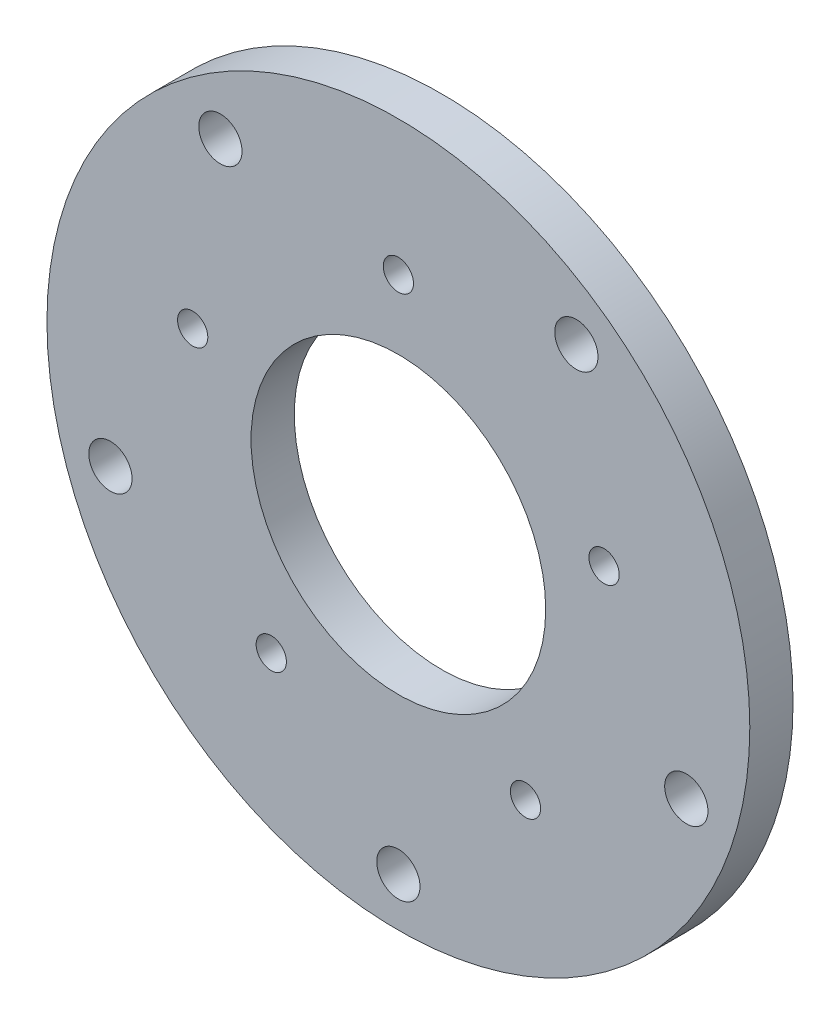
ISO-10303-21;
HEADER;
FILE_DESCRIPTION(('STEP AP214'),'2;1');
FILE_NAME('part.step','',(''),(''),'','','');
FILE_SCHEMA(('AUTOMOTIVE_DESIGN { 1 0 10303 214 1 1 1 1 }'));
ENDSEC;
DATA;
#1=APPLICATION_CONTEXT('core data for automotive mechanical design processes');
#2=APPLICATION_PROTOCOL_DEFINITION('international standard','automotive_design',2000,#1);
#3=PRODUCT_CONTEXT('',#1,'mechanical');
#4=PRODUCT('Part','Part','',(#3));
#5=PRODUCT_RELATED_PRODUCT_CATEGORY('part','',(#4));
#6=PRODUCT_DEFINITION_FORMATION('','',#4);
#7=PRODUCT_DEFINITION_CONTEXT('part definition',#1,'design');
#8=PRODUCT_DEFINITION('design','',#6,#7);
#9=PRODUCT_DEFINITION_SHAPE('','',#8);
#10=(LENGTH_UNIT() NAMED_UNIT(*) SI_UNIT(.MILLI.,.METRE.));
#11=(NAMED_UNIT(*) PLANE_ANGLE_UNIT() SI_UNIT($,.RADIAN.));
#12=(NAMED_UNIT(*) SI_UNIT($,.STERADIAN.) SOLID_ANGLE_UNIT());
#13=UNCERTAINTY_MEASURE_WITH_UNIT(LENGTH_MEASURE(1.E-05),#10,'distance_accuracy_value','');
#14=(GEOMETRIC_REPRESENTATION_CONTEXT(3) GLOBAL_UNCERTAINTY_ASSIGNED_CONTEXT((#13)) GLOBAL_UNIT_ASSIGNED_CONTEXT((#10,
#11,#12)) REPRESENTATION_CONTEXT('',''));
#15=CARTESIAN_POINT('',(0.,0.,0.));
#16=DIRECTION('',(0.,0.,1.));
#17=DIRECTION('',(1.,0.,0.));
#18=AXIS2_PLACEMENT_3D('',#15,#16,#17);
#19=CARTESIAN_POINT('',(-0.261189044756166,0.652972611890443,4.));
#20=DIRECTION('',(0.,0.,1.));
#21=DIRECTION('',(1.,0.,0.));
#22=AXIS2_PLACEMENT_3D('',#19,#20,#21);
#23=PLANE('',#22);
#24=CARTESIAN_POINT('',(18.759941281147,6.83331249938919,4.));
#25=DIRECTION('',(0.,0.,1.));
#26=DIRECTION('',(1.,0.,0.));
#27=AXIS2_PLACEMENT_3D('',#24,#25,#26);
#28=CIRCLE('',#27,1.4);
#29=CARTESIAN_POINT('',(20.159941281147,6.83331249938919,4.));
#30=VERTEX_POINT('',#29);
#31=EDGE_CURVE('E120',#30,#30,#28,.T.);
#32=ORIENTED_EDGE('',*,*,#31,.F.);
#33=EDGE_LOOP('',(#32));
#34=FACE_BOUND('',#33,.T.);
#35=CARTESIAN_POINT('',(-19.2823193706592,6.83331249938948,4.));
#36=DIRECTION('',(0.,0.,1.));
#37=DIRECTION('',(1.,0.,0.));
#38=AXIS2_PLACEMENT_3D('',#35,#36,#37);
#39=CIRCLE('',#38,1.4);
#40=CARTESIAN_POINT('',(-17.8823193706592,6.83331249938948,4.));
#41=VERTEX_POINT('',#40);
#42=EDGE_CURVE('E104',#41,#41,#39,.T.);
#43=ORIENTED_EDGE('',*,*,#42,.F.);
#44=EDGE_LOOP('',(#43));
#45=FACE_BOUND('',#44,.T.);
#46=CARTESIAN_POINT('',(26.368393411508,-7.99950323060838,4.));
#47=DIRECTION('',(0.,0.,1.));
#48=DIRECTION('',(1.,0.,0.));
#49=AXIS2_PLACEMENT_3D('',#46,#47,#48);
#50=CIRCLE('',#49,2.);
#51=CARTESIAN_POINT('',(28.368393411508,-7.99950323060838,4.));
#52=VERTEX_POINT('',#51);
#53=EDGE_CURVE('E88',#52,#52,#50,.T.);
#54=ORIENTED_EDGE('',*,*,#53,.F.);
#55=EDGE_LOOP('',(#54));
#56=FACE_BOUND('',#55,.T.);
#57=CARTESIAN_POINT('',(-16.7191761089453,23.3054484543891,4.));
#58=DIRECTION('',(0.,0.,1.));
#59=DIRECTION('',(1.,0.,0.));
#60=AXIS2_PLACEMENT_3D('',#57,#58,#59);
#61=CIRCLE('',#60,2.);
#62=CARTESIAN_POINT('',(-14.7191761089453,23.3054484543891,4.));
#63=VERTEX_POINT('',#62);
#64=EDGE_CURVE('E72',#63,#63,#61,.T.);
#65=ORIENTED_EDGE('',*,*,#64,.F.);
#66=EDGE_LOOP('',(#65));
#67=FACE_BOUND('',#66,.T.);
#68=CARTESIAN_POINT('',(-0.261189044756163,-27.3470273881096,4.));
#69=DIRECTION('',(0.,0.,1.));
#70=DIRECTION('',(1.,0.,0.));
#71=AXIS2_PLACEMENT_3D('',#68,#69,#70);
#72=CIRCLE('',#71,2.);
#73=CARTESIAN_POINT('',(1.73881095524384,-27.3470273881096,4.));
#74=VERTEX_POINT('',#73);
#75=EDGE_CURVE('E56',#74,#74,#72,.T.);
#76=ORIENTED_EDGE('',*,*,#75,.F.);
#77=EDGE_LOOP('',(#76));
#78=FACE_BOUND('',#77,.T.);
#79=CARTESIAN_POINT('',(-0.261189044756166,0.652972611890443,4.));
#80=DIRECTION('',(0.,0.,1.));
#81=DIRECTION('',(1.,0.,0.));
#82=AXIS2_PLACEMENT_3D('',#79,#80,#81);
#83=CIRCLE('',#82,32.5);
#84=CARTESIAN_POINT('',(32.2388109552438,0.652972611890443,4.));
#85=VERTEX_POINT('',#84);
#86=EDGE_CURVE('E10',#85,#85,#83,.T.);
#87=ORIENTED_EDGE('',*,*,#86,.T.);
#88=EDGE_LOOP('',(#87));
#89=FACE_BOUND('',#88,.T.);
#90=CARTESIAN_POINT('',(-0.261189044756166,0.652972611890443,4.));
#91=DIRECTION('',(0.,0.,1.));
#92=DIRECTION('',(1.,0.,0.));
#93=AXIS2_PLACEMENT_3D('',#90,#91,#92);
#94=CIRCLE('',#93,13.625);
#95=CARTESIAN_POINT('',(13.3638109552438,0.652972611890443,4.));
#96=VERTEX_POINT('',#95);
#97=EDGE_CURVE('E50',#96,#96,#94,.T.);
#98=ORIENTED_EDGE('',*,*,#97,.F.);
#99=EDGE_LOOP('',(#98));
#100=FACE_BOUND('',#99,.T.);
#101=CARTESIAN_POINT('',(-26.8907715010205,-7.99950323060802,4.));
#102=DIRECTION('',(0.,0.,1.));
#103=DIRECTION('',(1.,0.,0.));
#104=AXIS2_PLACEMENT_3D('',#101,#102,#103);
#105=CIRCLE('',#104,2.);
#106=CARTESIAN_POINT('',(-24.8907715010205,-7.99950323060802,4.));
#107=VERTEX_POINT('',#106);
#108=EDGE_CURVE('E64',#107,#107,#105,.T.);
#109=ORIENTED_EDGE('',*,*,#108,.F.);
#110=EDGE_LOOP('',(#109));
#111=FACE_BOUND('',#110,.T.);
#112=CARTESIAN_POINT('',(16.1967980194333,23.3054484543888,4.));
#113=DIRECTION('',(0.,0.,1.));
#114=DIRECTION('',(1.,0.,0.));
#115=AXIS2_PLACEMENT_3D('',#112,#113,#114);
#116=CIRCLE('',#115,2.);
#117=CARTESIAN_POINT('',(18.1967980194333,23.3054484543888,4.));
#118=VERTEX_POINT('',#117);
#119=EDGE_CURVE('E80',#118,#118,#116,.T.);
#120=ORIENTED_EDGE('',*,*,#119,.F.);
#121=EDGE_LOOP('',(#120));
#122=FACE_BOUND('',#121,.T.);
#123=CARTESIAN_POINT('',(-12.0168940906057,-15.5273672756085,4.));
#124=DIRECTION('',(0.,0.,1.));
#125=DIRECTION('',(1.,0.,0.));
#126=AXIS2_PLACEMENT_3D('',#123,#124,#125);
#127=CIRCLE('',#126,1.4);
#128=CARTESIAN_POINT('',(-10.6168940906057,-15.5273672756085,4.));
#129=VERTEX_POINT('',#128);
#130=EDGE_CURVE('E96',#129,#129,#127,.T.);
#131=ORIENTED_EDGE('',*,*,#130,.F.);
#132=EDGE_LOOP('',(#131));
#133=FACE_BOUND('',#132,.T.);
#134=CARTESIAN_POINT('',(-0.261189044756015,20.6529726118904,4.));
#135=DIRECTION('',(0.,0.,1.));
#136=DIRECTION('',(1.,0.,0.));
#137=AXIS2_PLACEMENT_3D('',#134,#135,#136);
#138=CIRCLE('',#137,1.4);
#139=CARTESIAN_POINT('',(1.13881095524398,20.6529726118904,4.));
#140=VERTEX_POINT('',#139);
#141=EDGE_CURVE('E112',#140,#140,#138,.T.);
#142=ORIENTED_EDGE('',*,*,#141,.F.);
#143=EDGE_LOOP('',(#142));
#144=FACE_BOUND('',#143,.T.);
#145=CARTESIAN_POINT('',(11.4945160010931,-15.5273672756087,4.));
#146=DIRECTION('',(0.,0.,1.));
#147=DIRECTION('',(1.,0.,0.));
#148=AXIS2_PLACEMENT_3D('',#145,#146,#147);
#149=CIRCLE('',#148,1.4);
#150=CARTESIAN_POINT('',(12.8945160010931,-15.5273672756087,4.));
#151=VERTEX_POINT('',#150);
#152=EDGE_CURVE('E128',#151,#151,#149,.T.);
#153=ORIENTED_EDGE('',*,*,#152,.F.);
#154=EDGE_LOOP('',(#153));
#155=FACE_BOUND('',#154,.T.);
#156=ADVANCED_FACE('F37',(#34,#45,#56,#67,#78,#89,#100,#111,#122,#133,#144,#155),#23,.T.);
#157=CARTESIAN_POINT('',(-0.261189044756166,0.652972611890443,0.));
#158=DIRECTION('',(0.,0.,1.));
#159=DIRECTION('',(1.,0.,0.));
#160=AXIS2_PLACEMENT_3D('',#157,#158,#159);
#161=PLANE('',#160);
#162=CARTESIAN_POINT('',(-0.261189044756166,0.652972611890443,0.));
#163=DIRECTION('',(0.,0.,1.));
#164=DIRECTION('',(1.,0.,0.));
#165=AXIS2_PLACEMENT_3D('',#162,#163,#164);
#166=CIRCLE('',#165,32.5);
#167=CARTESIAN_POINT('',(32.2388109552438,0.652972611890443,0.));
#168=VERTEX_POINT('',#167);
#169=EDGE_CURVE('E41',#168,#168,#166,.T.);
#170=ORIENTED_EDGE('',*,*,#169,.F.);
#171=EDGE_LOOP('',(#170));
#172=FACE_BOUND('',#171,.T.);
#173=CARTESIAN_POINT('',(-0.261189044756166,0.652972611890443,0.));
#174=DIRECTION('',(0.,0.,1.));
#175=DIRECTION('',(1.,0.,0.));
#176=AXIS2_PLACEMENT_3D('',#173,#174,#175);
#177=CIRCLE('',#176,13.625);
#178=CARTESIAN_POINT('',(13.3638109552438,0.652972611890443,0.));
#179=VERTEX_POINT('',#178);
#180=EDGE_CURVE('E52',#179,#179,#177,.T.);
#181=ORIENTED_EDGE('',*,*,#180,.T.);
#182=EDGE_LOOP('',(#181));
#183=FACE_BOUND('',#182,.T.);
#184=CARTESIAN_POINT('',(-0.261189044756163,-27.3470273881096,0.));
#185=DIRECTION('',(0.,0.,1.));
#186=DIRECTION('',(1.,0.,0.));
#187=AXIS2_PLACEMENT_3D('',#184,#185,#186);
#188=CIRCLE('',#187,2.);
#189=CARTESIAN_POINT('',(1.73881095524384,-27.3470273881096,0.));
#190=VERTEX_POINT('',#189);
#191=EDGE_CURVE('E60',#190,#190,#188,.T.);
#192=ORIENTED_EDGE('',*,*,#191,.T.);
#193=EDGE_LOOP('',(#192));
#194=FACE_BOUND('',#193,.T.);
#195=CARTESIAN_POINT('',(-26.8907715010205,-7.99950323060802,0.));
#196=DIRECTION('',(0.,0.,1.));
#197=DIRECTION('',(1.,0.,0.));
#198=AXIS2_PLACEMENT_3D('',#195,#196,#197);
#199=CIRCLE('',#198,2.);
#200=CARTESIAN_POINT('',(-24.8907715010205,-7.99950323060802,0.));
#201=VERTEX_POINT('',#200);
#202=EDGE_CURVE('E68',#201,#201,#199,.T.);
#203=ORIENTED_EDGE('',*,*,#202,.T.);
#204=EDGE_LOOP('',(#203));
#205=FACE_BOUND('',#204,.T.);
#206=CARTESIAN_POINT('',(-16.7191761089453,23.3054484543891,0.));
#207=DIRECTION('',(0.,0.,1.));
#208=DIRECTION('',(1.,0.,0.));
#209=AXIS2_PLACEMENT_3D('',#206,#207,#208);
#210=CIRCLE('',#209,2.);
#211=CARTESIAN_POINT('',(-14.7191761089453,23.3054484543891,0.));
#212=VERTEX_POINT('',#211);
#213=EDGE_CURVE('E76',#212,#212,#210,.T.);
#214=ORIENTED_EDGE('',*,*,#213,.T.);
#215=EDGE_LOOP('',(#214));
#216=FACE_BOUND('',#215,.T.);
#217=CARTESIAN_POINT('',(16.1967980194333,23.3054484543888,0.));
#218=DIRECTION('',(0.,0.,1.));
#219=DIRECTION('',(1.,0.,0.));
#220=AXIS2_PLACEMENT_3D('',#217,#218,#219);
#221=CIRCLE('',#220,2.);
#222=CARTESIAN_POINT('',(18.1967980194333,23.3054484543888,0.));
#223=VERTEX_POINT('',#222);
#224=EDGE_CURVE('E84',#223,#223,#221,.T.);
#225=ORIENTED_EDGE('',*,*,#224,.T.);
#226=EDGE_LOOP('',(#225));
#227=FACE_BOUND('',#226,.T.);
#228=CARTESIAN_POINT('',(26.368393411508,-7.99950323060838,0.));
#229=DIRECTION('',(0.,0.,1.));
#230=DIRECTION('',(1.,0.,0.));
#231=AXIS2_PLACEMENT_3D('',#228,#229,#230);
#232=CIRCLE('',#231,2.);
#233=CARTESIAN_POINT('',(28.368393411508,-7.99950323060838,0.));
#234=VERTEX_POINT('',#233);
#235=EDGE_CURVE('E92',#234,#234,#232,.T.);
#236=ORIENTED_EDGE('',*,*,#235,.T.);
#237=EDGE_LOOP('',(#236));
#238=FACE_BOUND('',#237,.T.);
#239=CARTESIAN_POINT('',(-12.0168940906057,-15.5273672756085,0.));
#240=DIRECTION('',(0.,0.,1.));
#241=DIRECTION('',(1.,0.,0.));
#242=AXIS2_PLACEMENT_3D('',#239,#240,#241);
#243=CIRCLE('',#242,1.4);
#244=CARTESIAN_POINT('',(-10.6168940906057,-15.5273672756085,0.));
#245=VERTEX_POINT('',#244);
#246=EDGE_CURVE('E100',#245,#245,#243,.T.);
#247=ORIENTED_EDGE('',*,*,#246,.T.);
#248=EDGE_LOOP('',(#247));
#249=FACE_BOUND('',#248,.T.);
#250=CARTESIAN_POINT('',(-19.2823193706592,6.83331249938948,0.));
#251=DIRECTION('',(0.,0.,1.));
#252=DIRECTION('',(1.,0.,0.));
#253=AXIS2_PLACEMENT_3D('',#250,#251,#252);
#254=CIRCLE('',#253,1.4);
#255=CARTESIAN_POINT('',(-17.8823193706592,6.83331249938948,0.));
#256=VERTEX_POINT('',#255);
#257=EDGE_CURVE('E108',#256,#256,#254,.T.);
#258=ORIENTED_EDGE('',*,*,#257,.T.);
#259=EDGE_LOOP('',(#258));
#260=FACE_BOUND('',#259,.T.);
#261=CARTESIAN_POINT('',(-0.261189044756015,20.6529726118904,0.));
#262=DIRECTION('',(0.,0.,1.));
#263=DIRECTION('',(1.,0.,0.));
#264=AXIS2_PLACEMENT_3D('',#261,#262,#263);
#265=CIRCLE('',#264,1.4);
#266=CARTESIAN_POINT('',(1.13881095524398,20.6529726118904,0.));
#267=VERTEX_POINT('',#266);
#268=EDGE_CURVE('E116',#267,#267,#265,.T.);
#269=ORIENTED_EDGE('',*,*,#268,.T.);
#270=EDGE_LOOP('',(#269));
#271=FACE_BOUND('',#270,.T.);
#272=CARTESIAN_POINT('',(18.759941281147,6.83331249938919,0.));
#273=DIRECTION('',(0.,0.,1.));
#274=DIRECTION('',(1.,0.,0.));
#275=AXIS2_PLACEMENT_3D('',#272,#273,#274);
#276=CIRCLE('',#275,1.4);
#277=CARTESIAN_POINT('',(20.159941281147,6.83331249938919,0.));
#278=VERTEX_POINT('',#277);
#279=EDGE_CURVE('E124',#278,#278,#276,.T.);
#280=ORIENTED_EDGE('',*,*,#279,.T.);
#281=EDGE_LOOP('',(#280));
#282=FACE_BOUND('',#281,.T.);
#283=CARTESIAN_POINT('',(11.4945160010931,-15.5273672756087,0.));
#284=DIRECTION('',(0.,0.,1.));
#285=DIRECTION('',(1.,0.,0.));
#286=AXIS2_PLACEMENT_3D('',#283,#284,#285);
#287=CIRCLE('',#286,1.4);
#288=CARTESIAN_POINT('',(12.8945160010931,-15.5273672756087,0.));
#289=VERTEX_POINT('',#288);
#290=EDGE_CURVE('E132',#289,#289,#287,.T.);
#291=ORIENTED_EDGE('',*,*,#290,.T.);
#292=EDGE_LOOP('',(#291));
#293=FACE_BOUND('',#292,.T.);
#294=ADVANCED_FACE('F144',(#172,#183,#194,#205,#216,#227,#238,#249,#260,#271,#282,#293),#161,.F.);
#295=CARTESIAN_POINT('',(-0.261189044756166,0.652972611890443,4.));
#296=DIRECTION('',(0.,0.,-1.));
#297=DIRECTION('',(-1.,0.,0.));
#298=AXIS2_PLACEMENT_3D('',#295,#296,#297);
#299=CYLINDRICAL_SURFACE('',#298,32.5);
#300=ORIENTED_EDGE('',*,*,#86,.F.);
#301=EDGE_LOOP('',(#300));
#302=FACE_BOUND('',#301,.T.);
#303=ORIENTED_EDGE('',*,*,#169,.T.);
#304=EDGE_LOOP('',(#303));
#305=FACE_BOUND('',#304,.T.);
#306=ADVANCED_FACE('F39',(#302,#305),#299,.T.);
#307=CARTESIAN_POINT('',(-0.261189044756166,0.652972611890443,4.));
#308=DIRECTION('',(0.,0.,-1.));
#309=DIRECTION('',(-1.,0.,0.));
#310=AXIS2_PLACEMENT_3D('',#307,#308,#309);
#311=CYLINDRICAL_SURFACE('',#310,13.625);
#312=ORIENTED_EDGE('',*,*,#97,.T.);
#313=EDGE_LOOP('',(#312));
#314=FACE_BOUND('',#313,.T.);
#315=ORIENTED_EDGE('',*,*,#180,.F.);
#316=EDGE_LOOP('',(#315));
#317=FACE_BOUND('',#316,.T.);
#318=ADVANCED_FACE('F154',(#314,#317),#311,.F.);
#319=CARTESIAN_POINT('',(-0.261189044756163,-27.3470273881096,4.));
#320=DIRECTION('',(0.,0.,-1.));
#321=DIRECTION('',(-1.,0.,0.));
#322=AXIS2_PLACEMENT_3D('',#319,#320,#321);
#323=CYLINDRICAL_SURFACE('',#322,2.);
#324=ORIENTED_EDGE('',*,*,#75,.T.);
#325=EDGE_LOOP('',(#324));
#326=FACE_BOUND('',#325,.T.);
#327=ORIENTED_EDGE('',*,*,#191,.F.);
#328=EDGE_LOOP('',(#327));
#329=FACE_BOUND('',#328,.T.);
#330=ADVANCED_FACE('F157',(#326,#329),#323,.F.);
#331=CARTESIAN_POINT('',(-26.8907715010205,-7.99950323060802,4.));
#332=DIRECTION('',(0.,0.,-1.));
#333=DIRECTION('',(-1.,0.,0.));
#334=AXIS2_PLACEMENT_3D('',#331,#332,#333);
#335=CYLINDRICAL_SURFACE('',#334,2.);
#336=ORIENTED_EDGE('',*,*,#108,.T.);
#337=EDGE_LOOP('',(#336));
#338=FACE_BOUND('',#337,.T.);
#339=ORIENTED_EDGE('',*,*,#202,.F.);
#340=EDGE_LOOP('',(#339));
#341=FACE_BOUND('',#340,.T.);
#342=ADVANCED_FACE('F161',(#338,#341),#335,.F.);
#343=CARTESIAN_POINT('',(-16.7191761089453,23.3054484543891,4.));
#344=DIRECTION('',(0.,0.,-1.));
#345=DIRECTION('',(-1.,0.,0.));
#346=AXIS2_PLACEMENT_3D('',#343,#344,#345);
#347=CYLINDRICAL_SURFACE('',#346,2.);
#348=ORIENTED_EDGE('',*,*,#64,.T.);
#349=EDGE_LOOP('',(#348));
#350=FACE_BOUND('',#349,.T.);
#351=ORIENTED_EDGE('',*,*,#213,.F.);
#352=EDGE_LOOP('',(#351));
#353=FACE_BOUND('',#352,.T.);
#354=ADVANCED_FACE('F165',(#350,#353),#347,.F.);
#355=CARTESIAN_POINT('',(16.1967980194333,23.3054484543888,4.));
#356=DIRECTION('',(0.,0.,-1.));
#357=DIRECTION('',(-1.,0.,0.));
#358=AXIS2_PLACEMENT_3D('',#355,#356,#357);
#359=CYLINDRICAL_SURFACE('',#358,2.);
#360=ORIENTED_EDGE('',*,*,#119,.T.);
#361=EDGE_LOOP('',(#360));
#362=FACE_BOUND('',#361,.T.);
#363=ORIENTED_EDGE('',*,*,#224,.F.);
#364=EDGE_LOOP('',(#363));
#365=FACE_BOUND('',#364,.T.);
#366=ADVANCED_FACE('F169',(#362,#365),#359,.F.);
#367=CARTESIAN_POINT('',(26.368393411508,-7.99950323060838,4.));
#368=DIRECTION('',(0.,0.,-1.));
#369=DIRECTION('',(-1.,0.,0.));
#370=AXIS2_PLACEMENT_3D('',#367,#368,#369);
#371=CYLINDRICAL_SURFACE('',#370,2.);
#372=ORIENTED_EDGE('',*,*,#53,.T.);
#373=EDGE_LOOP('',(#372));
#374=FACE_BOUND('',#373,.T.);
#375=ORIENTED_EDGE('',*,*,#235,.F.);
#376=EDGE_LOOP('',(#375));
#377=FACE_BOUND('',#376,.T.);
#378=ADVANCED_FACE('F173',(#374,#377),#371,.F.);
#379=CARTESIAN_POINT('',(-12.0168940906057,-15.5273672756085,4.));
#380=DIRECTION('',(0.,0.,-1.));
#381=DIRECTION('',(-1.,0.,0.));
#382=AXIS2_PLACEMENT_3D('',#379,#380,#381);
#383=CYLINDRICAL_SURFACE('',#382,1.4);
#384=ORIENTED_EDGE('',*,*,#130,.T.);
#385=EDGE_LOOP('',(#384));
#386=FACE_BOUND('',#385,.T.);
#387=ORIENTED_EDGE('',*,*,#246,.F.);
#388=EDGE_LOOP('',(#387));
#389=FACE_BOUND('',#388,.T.);
#390=ADVANCED_FACE('F177',(#386,#389),#383,.F.);
#391=CARTESIAN_POINT('',(-19.2823193706592,6.83331249938948,4.));
#392=DIRECTION('',(0.,0.,-1.));
#393=DIRECTION('',(-1.,0.,0.));
#394=AXIS2_PLACEMENT_3D('',#391,#392,#393);
#395=CYLINDRICAL_SURFACE('',#394,1.4);
#396=ORIENTED_EDGE('',*,*,#42,.T.);
#397=EDGE_LOOP('',(#396));
#398=FACE_BOUND('',#397,.T.);
#399=ORIENTED_EDGE('',*,*,#257,.F.);
#400=EDGE_LOOP('',(#399));
#401=FACE_BOUND('',#400,.T.);
#402=ADVANCED_FACE('F181',(#398,#401),#395,.F.);
#403=CARTESIAN_POINT('',(-0.261189044756015,20.6529726118904,4.));
#404=DIRECTION('',(0.,0.,-1.));
#405=DIRECTION('',(-1.,0.,0.));
#406=AXIS2_PLACEMENT_3D('',#403,#404,#405);
#407=CYLINDRICAL_SURFACE('',#406,1.4);
#408=ORIENTED_EDGE('',*,*,#141,.T.);
#409=EDGE_LOOP('',(#408));
#410=FACE_BOUND('',#409,.T.);
#411=ORIENTED_EDGE('',*,*,#268,.F.);
#412=EDGE_LOOP('',(#411));
#413=FACE_BOUND('',#412,.T.);
#414=ADVANCED_FACE('F185',(#410,#413),#407,.F.);
#415=CARTESIAN_POINT('',(18.759941281147,6.83331249938919,4.));
#416=DIRECTION('',(0.,0.,-1.));
#417=DIRECTION('',(-1.,0.,0.));
#418=AXIS2_PLACEMENT_3D('',#415,#416,#417);
#419=CYLINDRICAL_SURFACE('',#418,1.4);
#420=ORIENTED_EDGE('',*,*,#31,.T.);
#421=EDGE_LOOP('',(#420));
#422=FACE_BOUND('',#421,.T.);
#423=ORIENTED_EDGE('',*,*,#279,.F.);
#424=EDGE_LOOP('',(#423));
#425=FACE_BOUND('',#424,.T.);
#426=ADVANCED_FACE('F189',(#422,#425),#419,.F.);
#427=CARTESIAN_POINT('',(11.4945160010931,-15.5273672756087,4.));
#428=DIRECTION('',(0.,0.,-1.));
#429=DIRECTION('',(-1.,0.,0.));
#430=AXIS2_PLACEMENT_3D('',#427,#428,#429);
#431=CYLINDRICAL_SURFACE('',#430,1.4);
#432=ORIENTED_EDGE('',*,*,#152,.T.);
#433=EDGE_LOOP('',(#432));
#434=FACE_BOUND('',#433,.T.);
#435=ORIENTED_EDGE('',*,*,#290,.F.);
#436=EDGE_LOOP('',(#435));
#437=FACE_BOUND('',#436,.T.);
#438=ADVANCED_FACE('F140',(#434,#437),#431,.F.);
#439=CLOSED_SHELL('',(#156,#294,#306,#318,#330,#342,#354,#366,#378,#390,#402,#414,#426,#438));
#440=MANIFOLD_SOLID_BREP('B2',#439);
#441=ADVANCED_BREP_SHAPE_REPRESENTATION('',(#18,#440),#14);
#442=SHAPE_DEFINITION_REPRESENTATION(#9,#441);
ENDSEC;
END-ISO-10303-21;
